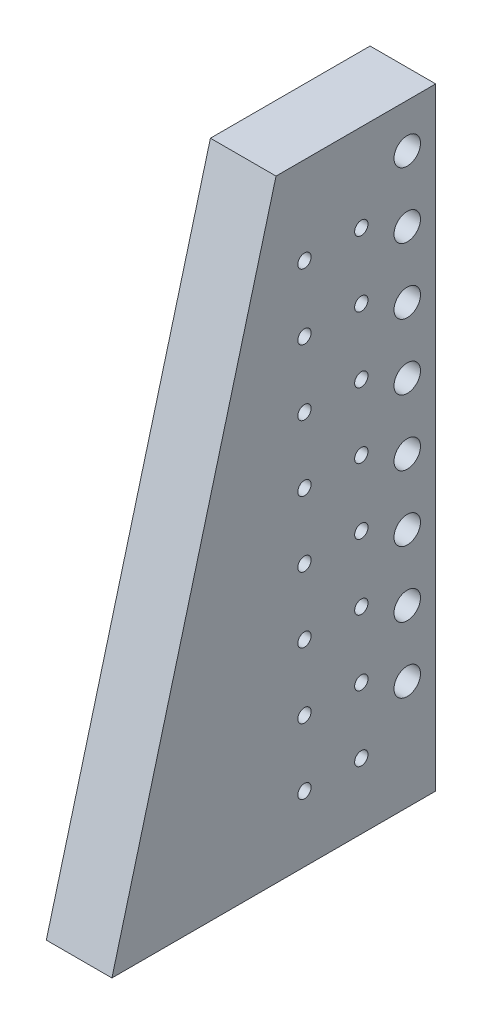
ISO-10303-21;
HEADER;
FILE_DESCRIPTION(('STEP AP214'),'2;1');
FILE_NAME('part.step','',(''),(''),'','','');
FILE_SCHEMA(('AUTOMOTIVE_DESIGN { 1 0 10303 214 1 1 1 1 }'));
ENDSEC;
DATA;
#1=APPLICATION_CONTEXT('core data for automotive mechanical design processes');
#2=APPLICATION_PROTOCOL_DEFINITION('international standard','automotive_design',2000,#1);
#3=PRODUCT_CONTEXT('',#1,'mechanical');
#4=PRODUCT('Part','Part','',(#3));
#5=PRODUCT_RELATED_PRODUCT_CATEGORY('part','',(#4));
#6=PRODUCT_DEFINITION_FORMATION('','',#4);
#7=PRODUCT_DEFINITION_CONTEXT('part definition',#1,'design');
#8=PRODUCT_DEFINITION('design','',#6,#7);
#9=PRODUCT_DEFINITION_SHAPE('','',#8);
#10=(LENGTH_UNIT() NAMED_UNIT(*) SI_UNIT(.MILLI.,.METRE.));
#11=(NAMED_UNIT(*) PLANE_ANGLE_UNIT() SI_UNIT($,.RADIAN.));
#12=(NAMED_UNIT(*) SI_UNIT($,.STERADIAN.) SOLID_ANGLE_UNIT());
#13=UNCERTAINTY_MEASURE_WITH_UNIT(LENGTH_MEASURE(1.E-05),#10,'distance_accuracy_value','');
#14=(GEOMETRIC_REPRESENTATION_CONTEXT(3) GLOBAL_UNCERTAINTY_ASSIGNED_CONTEXT((#13)) GLOBAL_UNIT_ASSIGNED_CONTEXT((#10,
#11,#12)) REPRESENTATION_CONTEXT('',''));
#15=CARTESIAN_POINT('',(0.,0.,0.));
#16=DIRECTION('',(0.,0.,1.));
#17=DIRECTION('',(1.,0.,0.));
#18=AXIS2_PLACEMENT_3D('',#15,#16,#17);
#19=CARTESIAN_POINT('',(15.,0.,0.));
#20=DIRECTION('',(-1.,0.,0.));
#21=DIRECTION('',(0.,0.,1.));
#22=AXIS2_PLACEMENT_3D('',#19,#20,#21);
#23=PLANE('',#22);
#24=DIRECTION('',(0.,1.,0.));
#25=VECTOR('',#24,1.);
#26=CARTESIAN_POINT('',(15.,-71.7948717948718,-17.9871794871795));
#27=LINE('',#26,#25);
#28=CARTESIAN_POINT('',(15.,-71.7948717948718,-17.9871794871795));
#29=VERTEX_POINT('',#28);
#30=CARTESIAN_POINT('',(15.,68.2051282051282,-17.9871794871795));
#31=VERTEX_POINT('',#30);
#32=EDGE_CURVE('E92',#29,#31,#27,.T.);
#33=ORIENTED_EDGE('',*,*,#32,.T.);
#34=DIRECTION('',(0.,0.,1.));
#35=VECTOR('',#34,1.);
#36=CARTESIAN_POINT('',(15.,68.2051282051282,18.5128205128205));
#37=LINE('',#36,#35);
#38=CARTESIAN_POINT('',(15.,68.2051282051282,18.5128205128205));
#39=VERTEX_POINT('',#38);
#40=EDGE_CURVE('E87',#31,#39,#37,.T.);
#41=ORIENTED_EDGE('',*,*,#40,.T.);
#42=DIRECTION('',(0.,-0.965925826289069,0.258819045102518));
#43=VECTOR('',#42,1.);
#44=CARTESIAN_POINT('',(15.,-71.7948717948718,56.0257074531772));
#45=LINE('',#44,#43);
#46=CARTESIAN_POINT('',(15.,-71.7948717948718,56.0257074531772));
#47=VERTEX_POINT('',#46);
#48=EDGE_CURVE('E90',#39,#47,#45,.T.);
#49=ORIENTED_EDGE('',*,*,#48,.T.);
#50=DIRECTION('',(0.,0.,-1.));
#51=VECTOR('',#50,1.);
#52=CARTESIAN_POINT('',(15.,-71.7948717948718,56.0257074531772));
#53=LINE('',#52,#51);
#54=EDGE_CURVE('E57',#47,#29,#53,.T.);
#55=ORIENTED_EDGE('',*,*,#54,.T.);
#56=EDGE_LOOP('',(#33,#41,#49,#55));
#57=FACE_BOUND('',#56,.T.);
#58=CARTESIAN_POINT('',(15.,48.205128205127,-0.987179487179588));
#59=DIRECTION('',(1.,0.,0.));
#60=DIRECTION('',(0.,0.,-1.));
#61=AXIS2_PLACEMENT_3D('',#58,#59,#60);
#62=CIRCLE('',#61,1.52500000000006);
#63=CARTESIAN_POINT('',(15.,48.205128205127,-2.51217948717965));
#64=VERTEX_POINT('',#63);
#65=EDGE_CURVE('E112',#64,#64,#62,.T.);
#66=ORIENTED_EDGE('',*,*,#65,.F.);
#67=EDGE_LOOP('',(#66));
#68=FACE_BOUND('',#67,.T.);
#69=CARTESIAN_POINT('',(15.,58.205128205127,-11.4871794871795));
#70=DIRECTION('',(1.,0.,0.));
#71=DIRECTION('',(0.,0.,-1.));
#72=AXIS2_PLACEMENT_3D('',#69,#70,#71);
#73=CIRCLE('',#72,3.02500000000035);
#74=CARTESIAN_POINT('',(15.,58.205128205127,-14.5121794871798));
#75=VERTEX_POINT('',#74);
#76=EDGE_CURVE('E134',#75,#75,#73,.T.);
#77=ORIENTED_EDGE('',*,*,#76,.F.);
#78=EDGE_LOOP('',(#77));
#79=FACE_BOUND('',#78,.T.);
#80=CARTESIAN_POINT('',(15.,43.2051282051282,-11.4871794871796));
#81=DIRECTION('',(1.,0.,0.));
#82=DIRECTION('',(0.,0.,-1.));
#83=AXIS2_PLACEMENT_3D('',#80,#81,#82);
#84=CIRCLE('',#83,3.025);
#85=CARTESIAN_POINT('',(15.,43.2051282051282,-14.5121794871796));
#86=VERTEX_POINT('',#85);
#87=EDGE_CURVE('E142',#86,#86,#84,.T.);
#88=ORIENTED_EDGE('',*,*,#87,.F.);
#89=EDGE_LOOP('',(#88));
#90=FACE_BOUND('',#89,.T.);
#91=CARTESIAN_POINT('',(15.,28.2051282051282,-11.4871794871798));
#92=DIRECTION('',(1.,0.,0.));
#93=DIRECTION('',(0.,0.,-1.));
#94=AXIS2_PLACEMENT_3D('',#91,#92,#93);
#95=CIRCLE('',#94,3.025);
#96=CARTESIAN_POINT('',(15.,28.2051282051282,-14.5121794871798));
#97=VERTEX_POINT('',#96);
#98=EDGE_CURVE('E150',#97,#97,#95,.T.);
#99=ORIENTED_EDGE('',*,*,#98,.F.);
#100=EDGE_LOOP('',(#99));
#101=FACE_BOUND('',#100,.T.);
#102=CARTESIAN_POINT('',(15.,13.2051282051282,-11.48717948718));
#103=DIRECTION('',(1.,0.,0.));
#104=DIRECTION('',(0.,0.,-1.));
#105=AXIS2_PLACEMENT_3D('',#102,#103,#104);
#106=CIRCLE('',#105,3.025);
#107=CARTESIAN_POINT('',(15.,13.2051282051282,-14.51217948718));
#108=VERTEX_POINT('',#107);
#109=EDGE_CURVE('E158',#108,#108,#106,.T.);
#110=ORIENTED_EDGE('',*,*,#109,.F.);
#111=EDGE_LOOP('',(#110));
#112=FACE_BOUND('',#111,.T.);
#113=CARTESIAN_POINT('',(15.,-1.7948717948718,-11.4871794871801));
#114=DIRECTION('',(1.,0.,0.));
#115=DIRECTION('',(0.,0.,-1.));
#116=AXIS2_PLACEMENT_3D('',#113,#114,#115);
#117=CIRCLE('',#116,3.025);
#118=CARTESIAN_POINT('',(15.,-1.7948717948718,-14.5121794871801));
#119=VERTEX_POINT('',#118);
#120=EDGE_CURVE('E166',#119,#119,#117,.T.);
#121=ORIENTED_EDGE('',*,*,#120,.F.);
#122=EDGE_LOOP('',(#121));
#123=FACE_BOUND('',#122,.T.);
#124=CARTESIAN_POINT('',(15.,-16.7948717948718,-11.4871794871803));
#125=DIRECTION('',(1.,0.,0.));
#126=DIRECTION('',(0.,0.,-1.));
#127=AXIS2_PLACEMENT_3D('',#124,#125,#126);
#128=CIRCLE('',#127,3.025);
#129=CARTESIAN_POINT('',(15.,-16.7948717948718,-14.5121794871803));
#130=VERTEX_POINT('',#129);
#131=EDGE_CURVE('E174',#130,#130,#128,.T.);
#132=ORIENTED_EDGE('',*,*,#131,.F.);
#133=EDGE_LOOP('',(#132));
#134=FACE_BOUND('',#133,.T.);
#135=CARTESIAN_POINT('',(15.,-31.7948717948718,-11.4871794871804));
#136=DIRECTION('',(1.,0.,0.));
#137=DIRECTION('',(0.,0.,-1.));
#138=AXIS2_PLACEMENT_3D('',#135,#136,#137);
#139=CIRCLE('',#138,3.025);
#140=CARTESIAN_POINT('',(15.,-31.7948717948718,-14.5121794871804));
#141=VERTEX_POINT('',#140);
#142=EDGE_CURVE('E182',#141,#141,#139,.T.);
#143=ORIENTED_EDGE('',*,*,#142,.F.);
#144=EDGE_LOOP('',(#143));
#145=FACE_BOUND('',#144,.T.);
#146=CARTESIAN_POINT('',(15.,-46.7948717948718,-11.4871794871806));
#147=DIRECTION('',(1.,0.,0.));
#148=DIRECTION('',(0.,0.,-1.));
#149=AXIS2_PLACEMENT_3D('',#146,#147,#148);
#150=CIRCLE('',#149,3.025);
#151=CARTESIAN_POINT('',(15.,-46.7948717948718,-14.5121794871806));
#152=VERTEX_POINT('',#151);
#153=EDGE_CURVE('E190',#152,#152,#150,.T.);
#154=ORIENTED_EDGE('',*,*,#153,.F.);
#155=EDGE_LOOP('',(#154));
#156=FACE_BOUND('',#155,.T.);
#157=CARTESIAN_POINT('',(15.,48.2051282051255,12.0128205128204));
#158=DIRECTION('',(1.,0.,0.));
#159=DIRECTION('',(0.,0.,-1.));
#160=AXIS2_PLACEMENT_3D('',#157,#158,#159);
#161=CIRCLE('',#160,1.52500000000014);
#162=CARTESIAN_POINT('',(15.,48.2051282051255,10.4878205128203));
#163=VERTEX_POINT('',#162);
#164=EDGE_CURVE('E198',#163,#163,#161,.T.);
#165=ORIENTED_EDGE('',*,*,#164,.F.);
#166=EDGE_LOOP('',(#165));
#167=FACE_BOUND('',#166,.T.);
#168=CARTESIAN_POINT('',(15.,33.2051282051289,-0.987179487179744));
#169=DIRECTION('',(1.,0.,0.));
#170=DIRECTION('',(0.,0.,-1.));
#171=AXIS2_PLACEMENT_3D('',#168,#169,#170);
#172=CIRCLE('',#171,1.525);
#173=CARTESIAN_POINT('',(15.,33.2051282051289,-2.51217948717974));
#174=VERTEX_POINT('',#173);
#175=EDGE_CURVE('E206',#174,#174,#172,.T.);
#176=ORIENTED_EDGE('',*,*,#175,.F.);
#177=EDGE_LOOP('',(#176));
#178=FACE_BOUND('',#177,.T.);
#179=CARTESIAN_POINT('',(15.,33.2051282051275,12.0128205128203));
#180=DIRECTION('',(1.,0.,0.));
#181=DIRECTION('',(0.,0.,-1.));
#182=AXIS2_PLACEMENT_3D('',#179,#180,#181);
#183=CIRCLE('',#182,1.525);
#184=CARTESIAN_POINT('',(15.,33.2051282051275,10.4878205128203));
#185=VERTEX_POINT('',#184);
#186=EDGE_CURVE('E214',#185,#185,#183,.T.);
#187=ORIENTED_EDGE('',*,*,#186,.F.);
#188=EDGE_LOOP('',(#187));
#189=FACE_BOUND('',#188,.T.);
#190=CARTESIAN_POINT('',(15.,18.2051282051309,-0.9871794871799));
#191=DIRECTION('',(1.,0.,0.));
#192=DIRECTION('',(0.,0.,-1.));
#193=AXIS2_PLACEMENT_3D('',#190,#191,#192);
#194=CIRCLE('',#193,1.525);
#195=CARTESIAN_POINT('',(15.,18.2051282051309,-2.5121794871799));
#196=VERTEX_POINT('',#195);
#197=EDGE_CURVE('E222',#196,#196,#194,.T.);
#198=ORIENTED_EDGE('',*,*,#197,.F.);
#199=EDGE_LOOP('',(#198));
#200=FACE_BOUND('',#199,.T.);
#201=CARTESIAN_POINT('',(15.,18.2051282051294,12.0128205128201));
#202=DIRECTION('',(1.,0.,0.));
#203=DIRECTION('',(0.,0.,-1.));
#204=AXIS2_PLACEMENT_3D('',#201,#202,#203);
#205=CIRCLE('',#204,1.525);
#206=CARTESIAN_POINT('',(15.,18.2051282051294,10.4878205128201));
#207=VERTEX_POINT('',#206);
#208=EDGE_CURVE('E230',#207,#207,#205,.T.);
#209=ORIENTED_EDGE('',*,*,#208,.F.);
#210=EDGE_LOOP('',(#209));
#211=FACE_BOUND('',#210,.T.);
#212=CARTESIAN_POINT('',(15.,3.20512820513282,-0.987179487180056));
#213=DIRECTION('',(1.,0.,0.));
#214=DIRECTION('',(0.,0.,-1.));
#215=AXIS2_PLACEMENT_3D('',#212,#213,#214);
#216=CIRCLE('',#215,1.525);
#217=CARTESIAN_POINT('',(15.,3.20512820513282,-2.51217948718006));
#218=VERTEX_POINT('',#217);
#219=EDGE_CURVE('E238',#218,#218,#216,.T.);
#220=ORIENTED_EDGE('',*,*,#219,.F.);
#221=EDGE_LOOP('',(#220));
#222=FACE_BOUND('',#221,.T.);
#223=CARTESIAN_POINT('',(15.,3.20512820513135,12.0128205128199));
#224=DIRECTION('',(1.,0.,0.));
#225=DIRECTION('',(0.,0.,-1.));
#226=AXIS2_PLACEMENT_3D('',#223,#224,#225);
#227=CIRCLE('',#226,1.525);
#228=CARTESIAN_POINT('',(15.,3.20512820513135,10.4878205128199));
#229=VERTEX_POINT('',#228);
#230=EDGE_CURVE('E246',#229,#229,#227,.T.);
#231=ORIENTED_EDGE('',*,*,#230,.F.);
#232=EDGE_LOOP('',(#231));
#233=FACE_BOUND('',#232,.T.);
#234=CARTESIAN_POINT('',(15.,-11.7948717948652,-0.987179487180213));
#235=DIRECTION('',(1.,0.,0.));
#236=DIRECTION('',(0.,0.,-1.));
#237=AXIS2_PLACEMENT_3D('',#234,#235,#236);
#238=CIRCLE('',#237,1.525);
#239=CARTESIAN_POINT('',(15.,-11.7948717948652,-2.51217948718021));
#240=VERTEX_POINT('',#239);
#241=EDGE_CURVE('E254',#240,#240,#238,.T.);
#242=ORIENTED_EDGE('',*,*,#241,.F.);
#243=EDGE_LOOP('',(#242));
#244=FACE_BOUND('',#243,.T.);
#245=CARTESIAN_POINT('',(15.,-11.7948717948667,12.0128205128198));
#246=DIRECTION('',(1.,0.,0.));
#247=DIRECTION('',(0.,0.,-1.));
#248=AXIS2_PLACEMENT_3D('',#245,#246,#247);
#249=CIRCLE('',#248,1.525);
#250=CARTESIAN_POINT('',(15.,-11.7948717948667,10.4878205128198));
#251=VERTEX_POINT('',#250);
#252=EDGE_CURVE('E262',#251,#251,#249,.T.);
#253=ORIENTED_EDGE('',*,*,#252,.F.);
#254=EDGE_LOOP('',(#253));
#255=FACE_BOUND('',#254,.T.);
#256=CARTESIAN_POINT('',(15.,-26.7948717948633,-0.987179487180369));
#257=DIRECTION('',(1.,0.,0.));
#258=DIRECTION('',(0.,0.,-1.));
#259=AXIS2_PLACEMENT_3D('',#256,#257,#258);
#260=CIRCLE('',#259,1.525);
#261=CARTESIAN_POINT('',(15.,-26.7948717948633,-2.51217948718037));
#262=VERTEX_POINT('',#261);
#263=EDGE_CURVE('E270',#262,#262,#260,.T.);
#264=ORIENTED_EDGE('',*,*,#263,.F.);
#265=EDGE_LOOP('',(#264));
#266=FACE_BOUND('',#265,.T.);
#267=CARTESIAN_POINT('',(15.,-26.7948717948648,12.0128205128196));
#268=DIRECTION('',(1.,0.,0.));
#269=DIRECTION('',(0.,0.,-1.));
#270=AXIS2_PLACEMENT_3D('',#267,#268,#269);
#271=CIRCLE('',#270,1.525);
#272=CARTESIAN_POINT('',(15.,-26.7948717948648,10.4878205128196));
#273=VERTEX_POINT('',#272);
#274=EDGE_CURVE('E278',#273,#273,#271,.T.);
#275=ORIENTED_EDGE('',*,*,#274,.F.);
#276=EDGE_LOOP('',(#275));
#277=FACE_BOUND('',#276,.T.);
#278=CARTESIAN_POINT('',(15.,-41.7948717948614,-0.987179487180525));
#279=DIRECTION('',(1.,0.,0.));
#280=DIRECTION('',(0.,0.,-1.));
#281=AXIS2_PLACEMENT_3D('',#278,#279,#280);
#282=CIRCLE('',#281,1.525);
#283=CARTESIAN_POINT('',(15.,-41.7948717948614,-2.51217948718052));
#284=VERTEX_POINT('',#283);
#285=EDGE_CURVE('E286',#284,#284,#282,.T.);
#286=ORIENTED_EDGE('',*,*,#285,.F.);
#287=EDGE_LOOP('',(#286));
#288=FACE_BOUND('',#287,.T.);
#289=CARTESIAN_POINT('',(15.,-41.7948717948628,12.0128205128195));
#290=DIRECTION('',(1.,0.,0.));
#291=DIRECTION('',(0.,0.,-1.));
#292=AXIS2_PLACEMENT_3D('',#289,#290,#291);
#293=CIRCLE('',#292,1.525);
#294=CARTESIAN_POINT('',(15.,-41.7948717948628,10.4878205128195));
#295=VERTEX_POINT('',#294);
#296=EDGE_CURVE('E294',#295,#295,#293,.T.);
#297=ORIENTED_EDGE('',*,*,#296,.F.);
#298=EDGE_LOOP('',(#297));
#299=FACE_BOUND('',#298,.T.);
#300=CARTESIAN_POINT('',(15.,-56.7948717948594,-0.987179487180681));
#301=DIRECTION('',(1.,0.,0.));
#302=DIRECTION('',(0.,0.,-1.));
#303=AXIS2_PLACEMENT_3D('',#300,#301,#302);
#304=CIRCLE('',#303,1.525);
#305=CARTESIAN_POINT('',(15.,-56.7948717948594,-2.51217948718068));
#306=VERTEX_POINT('',#305);
#307=EDGE_CURVE('E302',#306,#306,#304,.T.);
#308=ORIENTED_EDGE('',*,*,#307,.F.);
#309=EDGE_LOOP('',(#308));
#310=FACE_BOUND('',#309,.T.);
#311=CARTESIAN_POINT('',(15.,-56.7948717948609,12.0128205128193));
#312=DIRECTION('',(1.,0.,0.));
#313=DIRECTION('',(0.,0.,-1.));
#314=AXIS2_PLACEMENT_3D('',#311,#312,#313);
#315=CIRCLE('',#314,1.525);
#316=CARTESIAN_POINT('',(15.,-56.7948717948609,10.4878205128193));
#317=VERTEX_POINT('',#316);
#318=EDGE_CURVE('E310',#317,#317,#315,.T.);
#319=ORIENTED_EDGE('',*,*,#318,.F.);
#320=EDGE_LOOP('',(#319));
#321=FACE_BOUND('',#320,.T.);
#322=ADVANCED_FACE('F39',(#57,#68,#79,#90,#101,#112,#123,#134,#145,#156,#167,#178,#189,#200,
#211,#222,#233,#244,#255,#266,#277,#288,#299,#310,#321),#23,.F.);
#323=CARTESIAN_POINT('',(0.,0.,0.));
#324=DIRECTION('',(-1.,0.,0.));
#325=DIRECTION('',(0.,0.,1.));
#326=AXIS2_PLACEMENT_3D('',#323,#324,#325);
#327=PLANE('',#326);
#328=CARTESIAN_POINT('',(0.,-56.7948717948594,-0.987179487180681));
#329=DIRECTION('',(1.,0.,0.));
#330=DIRECTION('',(0.,0.,-1.));
#331=AXIS2_PLACEMENT_3D('',#328,#329,#330);
#332=CIRCLE('',#331,1.525);
#333=CARTESIAN_POINT('',(0.,-56.7948717948594,-2.51217948718068));
#334=VERTEX_POINT('',#333);
#335=EDGE_CURVE('E306',#334,#334,#332,.T.);
#336=ORIENTED_EDGE('',*,*,#335,.T.);
#337=EDGE_LOOP('',(#336));
#338=FACE_BOUND('',#337,.T.);
#339=CARTESIAN_POINT('',(0.,-41.7948717948614,-0.987179487180525));
#340=DIRECTION('',(1.,0.,0.));
#341=DIRECTION('',(0.,0.,-1.));
#342=AXIS2_PLACEMENT_3D('',#339,#340,#341);
#343=CIRCLE('',#342,1.525);
#344=CARTESIAN_POINT('',(0.,-41.7948717948614,-2.51217948718052));
#345=VERTEX_POINT('',#344);
#346=EDGE_CURVE('E290',#345,#345,#343,.T.);
#347=ORIENTED_EDGE('',*,*,#346,.T.);
#348=EDGE_LOOP('',(#347));
#349=FACE_BOUND('',#348,.T.);
#350=CARTESIAN_POINT('',(0.,-26.7948717948633,-0.987179487180369));
#351=DIRECTION('',(1.,0.,0.));
#352=DIRECTION('',(0.,0.,-1.));
#353=AXIS2_PLACEMENT_3D('',#350,#351,#352);
#354=CIRCLE('',#353,1.525);
#355=CARTESIAN_POINT('',(0.,-26.7948717948633,-2.51217948718037));
#356=VERTEX_POINT('',#355);
#357=EDGE_CURVE('E274',#356,#356,#354,.T.);
#358=ORIENTED_EDGE('',*,*,#357,.T.);
#359=EDGE_LOOP('',(#358));
#360=FACE_BOUND('',#359,.T.);
#361=CARTESIAN_POINT('',(0.,-11.7948717948652,-0.987179487180213));
#362=DIRECTION('',(1.,0.,0.));
#363=DIRECTION('',(0.,0.,-1.));
#364=AXIS2_PLACEMENT_3D('',#361,#362,#363);
#365=CIRCLE('',#364,1.525);
#366=CARTESIAN_POINT('',(0.,-11.7948717948652,-2.51217948718021));
#367=VERTEX_POINT('',#366);
#368=EDGE_CURVE('E258',#367,#367,#365,.T.);
#369=ORIENTED_EDGE('',*,*,#368,.T.);
#370=EDGE_LOOP('',(#369));
#371=FACE_BOUND('',#370,.T.);
#372=CARTESIAN_POINT('',(0.,3.20512820513282,-0.987179487180056));
#373=DIRECTION('',(1.,0.,0.));
#374=DIRECTION('',(0.,0.,-1.));
#375=AXIS2_PLACEMENT_3D('',#372,#373,#374);
#376=CIRCLE('',#375,1.525);
#377=CARTESIAN_POINT('',(0.,3.20512820513282,-2.51217948718006));
#378=VERTEX_POINT('',#377);
#379=EDGE_CURVE('E242',#378,#378,#376,.T.);
#380=ORIENTED_EDGE('',*,*,#379,.T.);
#381=EDGE_LOOP('',(#380));
#382=FACE_BOUND('',#381,.T.);
#383=CARTESIAN_POINT('',(0.,18.2051282051309,-0.9871794871799));
#384=DIRECTION('',(1.,0.,0.));
#385=DIRECTION('',(0.,0.,-1.));
#386=AXIS2_PLACEMENT_3D('',#383,#384,#385);
#387=CIRCLE('',#386,1.525);
#388=CARTESIAN_POINT('',(0.,18.2051282051309,-2.5121794871799));
#389=VERTEX_POINT('',#388);
#390=EDGE_CURVE('E226',#389,#389,#387,.T.);
#391=ORIENTED_EDGE('',*,*,#390,.T.);
#392=EDGE_LOOP('',(#391));
#393=FACE_BOUND('',#392,.T.);
#394=CARTESIAN_POINT('',(0.,33.2051282051289,-0.987179487179744));
#395=DIRECTION('',(1.,0.,0.));
#396=DIRECTION('',(0.,0.,-1.));
#397=AXIS2_PLACEMENT_3D('',#394,#395,#396);
#398=CIRCLE('',#397,1.525);
#399=CARTESIAN_POINT('',(0.,33.2051282051289,-2.51217948717974));
#400=VERTEX_POINT('',#399);
#401=EDGE_CURVE('E210',#400,#400,#398,.T.);
#402=ORIENTED_EDGE('',*,*,#401,.T.);
#403=EDGE_LOOP('',(#402));
#404=FACE_BOUND('',#403,.T.);
#405=CARTESIAN_POINT('',(0.,-46.7948717948718,-11.4871794871806));
#406=DIRECTION('',(1.,0.,0.));
#407=DIRECTION('',(0.,0.,-1.));
#408=AXIS2_PLACEMENT_3D('',#405,#406,#407);
#409=CIRCLE('',#408,3.025);
#410=CARTESIAN_POINT('',(0.,-46.7948717948718,-14.5121794871806));
#411=VERTEX_POINT('',#410);
#412=EDGE_CURVE('E194',#411,#411,#409,.T.);
#413=ORIENTED_EDGE('',*,*,#412,.T.);
#414=EDGE_LOOP('',(#413));
#415=FACE_BOUND('',#414,.T.);
#416=CARTESIAN_POINT('',(0.,-16.7948717948718,-11.4871794871803));
#417=DIRECTION('',(1.,0.,0.));
#418=DIRECTION('',(0.,0.,-1.));
#419=AXIS2_PLACEMENT_3D('',#416,#417,#418);
#420=CIRCLE('',#419,3.025);
#421=CARTESIAN_POINT('',(0.,-16.7948717948718,-14.5121794871803));
#422=VERTEX_POINT('',#421);
#423=EDGE_CURVE('E178',#422,#422,#420,.T.);
#424=ORIENTED_EDGE('',*,*,#423,.T.);
#425=EDGE_LOOP('',(#424));
#426=FACE_BOUND('',#425,.T.);
#427=CARTESIAN_POINT('',(0.,13.2051282051282,-11.48717948718));
#428=DIRECTION('',(1.,0.,0.));
#429=DIRECTION('',(0.,0.,-1.));
#430=AXIS2_PLACEMENT_3D('',#427,#428,#429);
#431=CIRCLE('',#430,3.025);
#432=CARTESIAN_POINT('',(0.,13.2051282051282,-14.51217948718));
#433=VERTEX_POINT('',#432);
#434=EDGE_CURVE('E162',#433,#433,#431,.T.);
#435=ORIENTED_EDGE('',*,*,#434,.T.);
#436=EDGE_LOOP('',(#435));
#437=FACE_BOUND('',#436,.T.);
#438=CARTESIAN_POINT('',(0.,43.2051282051282,-11.4871794871796));
#439=DIRECTION('',(1.,0.,0.));
#440=DIRECTION('',(0.,0.,-1.));
#441=AXIS2_PLACEMENT_3D('',#438,#439,#440);
#442=CIRCLE('',#441,3.025);
#443=CARTESIAN_POINT('',(0.,43.2051282051282,-14.5121794871796));
#444=VERTEX_POINT('',#443);
#445=EDGE_CURVE('E146',#444,#444,#442,.T.);
#446=ORIENTED_EDGE('',*,*,#445,.T.);
#447=EDGE_LOOP('',(#446));
#448=FACE_BOUND('',#447,.T.);
#449=CARTESIAN_POINT('',(0.,48.205128205127,-0.987179487179588));
#450=DIRECTION('',(1.,0.,0.));
#451=DIRECTION('',(0.,0.,-1.));
#452=AXIS2_PLACEMENT_3D('',#449,#450,#451);
#453=CIRCLE('',#452,1.52500000000006);
#454=CARTESIAN_POINT('',(0.,48.205128205127,-2.51217948717965));
#455=VERTEX_POINT('',#454);
#456=EDGE_CURVE('E130',#455,#455,#453,.T.);
#457=ORIENTED_EDGE('',*,*,#456,.T.);
#458=EDGE_LOOP('',(#457));
#459=FACE_BOUND('',#458,.T.);
#460=DIRECTION('',(0.,1.,0.));
#461=VECTOR('',#460,1.);
#462=CARTESIAN_POINT('',(0.,-71.7948717948718,-17.9871794871795));
#463=LINE('',#462,#461);
#464=CARTESIAN_POINT('',(0.,-71.7948717948718,-17.9871794871795));
#465=VERTEX_POINT('',#464);
#466=CARTESIAN_POINT('',(0.,68.2051282051282,-17.9871794871795));
#467=VERTEX_POINT('',#466);
#468=EDGE_CURVE('E108',#465,#467,#463,.T.);
#469=ORIENTED_EDGE('',*,*,#468,.F.);
#470=DIRECTION('',(0.,0.,-1.));
#471=VECTOR('',#470,1.);
#472=CARTESIAN_POINT('',(0.,-71.7948717948718,56.0257074531772));
#473=LINE('',#472,#471);
#474=CARTESIAN_POINT('',(0.,-71.7948717948718,56.0257074531772));
#475=VERTEX_POINT('',#474);
#476=EDGE_CURVE('E80',#475,#465,#473,.T.);
#477=ORIENTED_EDGE('',*,*,#476,.F.);
#478=DIRECTION('',(0.,-0.965925826289069,0.258819045102518));
#479=VECTOR('',#478,1.);
#480=CARTESIAN_POINT('',(0.,-71.7948717948718,56.0257074531772));
#481=LINE('',#480,#479);
#482=CARTESIAN_POINT('',(0.,68.2051282051282,18.5128205128205));
#483=VERTEX_POINT('',#482);
#484=EDGE_CURVE('E74',#483,#475,#481,.T.);
#485=ORIENTED_EDGE('',*,*,#484,.F.);
#486=DIRECTION('',(0.,0.,1.));
#487=VECTOR('',#486,1.);
#488=CARTESIAN_POINT('',(0.,68.2051282051282,18.5128205128205));
#489=LINE('',#488,#487);
#490=EDGE_CURVE('E97',#467,#483,#489,.T.);
#491=ORIENTED_EDGE('',*,*,#490,.F.);
#492=EDGE_LOOP('',(#469,#477,#485,#491));
#493=FACE_BOUND('',#492,.T.);
#494=CARTESIAN_POINT('',(0.,58.205128205127,-11.4871794871795));
#495=DIRECTION('',(1.,0.,0.));
#496=DIRECTION('',(0.,0.,-1.));
#497=AXIS2_PLACEMENT_3D('',#494,#495,#496);
#498=CIRCLE('',#497,3.02500000000035);
#499=CARTESIAN_POINT('',(0.,58.205128205127,-14.5121794871798));
#500=VERTEX_POINT('',#499);
#501=EDGE_CURVE('E138',#500,#500,#498,.T.);
#502=ORIENTED_EDGE('',*,*,#501,.T.);
#503=EDGE_LOOP('',(#502));
#504=FACE_BOUND('',#503,.T.);
#505=CARTESIAN_POINT('',(0.,28.2051282051282,-11.4871794871798));
#506=DIRECTION('',(1.,0.,0.));
#507=DIRECTION('',(0.,0.,-1.));
#508=AXIS2_PLACEMENT_3D('',#505,#506,#507);
#509=CIRCLE('',#508,3.025);
#510=CARTESIAN_POINT('',(0.,28.2051282051282,-14.5121794871798));
#511=VERTEX_POINT('',#510);
#512=EDGE_CURVE('E154',#511,#511,#509,.T.);
#513=ORIENTED_EDGE('',*,*,#512,.T.);
#514=EDGE_LOOP('',(#513));
#515=FACE_BOUND('',#514,.T.);
#516=CARTESIAN_POINT('',(0.,-1.7948717948718,-11.4871794871801));
#517=DIRECTION('',(1.,0.,0.));
#518=DIRECTION('',(0.,0.,-1.));
#519=AXIS2_PLACEMENT_3D('',#516,#517,#518);
#520=CIRCLE('',#519,3.025);
#521=CARTESIAN_POINT('',(0.,-1.7948717948718,-14.5121794871801));
#522=VERTEX_POINT('',#521);
#523=EDGE_CURVE('E170',#522,#522,#520,.T.);
#524=ORIENTED_EDGE('',*,*,#523,.T.);
#525=EDGE_LOOP('',(#524));
#526=FACE_BOUND('',#525,.T.);
#527=CARTESIAN_POINT('',(0.,-31.7948717948718,-11.4871794871804));
#528=DIRECTION('',(1.,0.,0.));
#529=DIRECTION('',(0.,0.,-1.));
#530=AXIS2_PLACEMENT_3D('',#527,#528,#529);
#531=CIRCLE('',#530,3.025);
#532=CARTESIAN_POINT('',(0.,-31.7948717948718,-14.5121794871804));
#533=VERTEX_POINT('',#532);
#534=EDGE_CURVE('E186',#533,#533,#531,.T.);
#535=ORIENTED_EDGE('',*,*,#534,.T.);
#536=EDGE_LOOP('',(#535));
#537=FACE_BOUND('',#536,.T.);
#538=CARTESIAN_POINT('',(0.,48.2051282051255,12.0128205128204));
#539=DIRECTION('',(1.,0.,0.));
#540=DIRECTION('',(0.,0.,-1.));
#541=AXIS2_PLACEMENT_3D('',#538,#539,#540);
#542=CIRCLE('',#541,1.52500000000014);
#543=CARTESIAN_POINT('',(0.,48.2051282051255,10.4878205128203));
#544=VERTEX_POINT('',#543);
#545=EDGE_CURVE('E202',#544,#544,#542,.T.);
#546=ORIENTED_EDGE('',*,*,#545,.T.);
#547=EDGE_LOOP('',(#546));
#548=FACE_BOUND('',#547,.T.);
#549=CARTESIAN_POINT('',(0.,33.2051282051275,12.0128205128203));
#550=DIRECTION('',(1.,0.,0.));
#551=DIRECTION('',(0.,0.,-1.));
#552=AXIS2_PLACEMENT_3D('',#549,#550,#551);
#553=CIRCLE('',#552,1.525);
#554=CARTESIAN_POINT('',(0.,33.2051282051275,10.4878205128203));
#555=VERTEX_POINT('',#554);
#556=EDGE_CURVE('E218',#555,#555,#553,.T.);
#557=ORIENTED_EDGE('',*,*,#556,.T.);
#558=EDGE_LOOP('',(#557));
#559=FACE_BOUND('',#558,.T.);
#560=CARTESIAN_POINT('',(0.,18.2051282051294,12.0128205128201));
#561=DIRECTION('',(1.,0.,0.));
#562=DIRECTION('',(0.,0.,-1.));
#563=AXIS2_PLACEMENT_3D('',#560,#561,#562);
#564=CIRCLE('',#563,1.525);
#565=CARTESIAN_POINT('',(0.,18.2051282051294,10.4878205128201));
#566=VERTEX_POINT('',#565);
#567=EDGE_CURVE('E234',#566,#566,#564,.T.);
#568=ORIENTED_EDGE('',*,*,#567,.T.);
#569=EDGE_LOOP('',(#568));
#570=FACE_BOUND('',#569,.T.);
#571=CARTESIAN_POINT('',(0.,3.20512820513135,12.0128205128199));
#572=DIRECTION('',(1.,0.,0.));
#573=DIRECTION('',(0.,0.,-1.));
#574=AXIS2_PLACEMENT_3D('',#571,#572,#573);
#575=CIRCLE('',#574,1.525);
#576=CARTESIAN_POINT('',(0.,3.20512820513135,10.4878205128199));
#577=VERTEX_POINT('',#576);
#578=EDGE_CURVE('E250',#577,#577,#575,.T.);
#579=ORIENTED_EDGE('',*,*,#578,.T.);
#580=EDGE_LOOP('',(#579));
#581=FACE_BOUND('',#580,.T.);
#582=CARTESIAN_POINT('',(0.,-11.7948717948667,12.0128205128198));
#583=DIRECTION('',(1.,0.,0.));
#584=DIRECTION('',(0.,0.,-1.));
#585=AXIS2_PLACEMENT_3D('',#582,#583,#584);
#586=CIRCLE('',#585,1.525);
#587=CARTESIAN_POINT('',(0.,-11.7948717948667,10.4878205128198));
#588=VERTEX_POINT('',#587);
#589=EDGE_CURVE('E266',#588,#588,#586,.T.);
#590=ORIENTED_EDGE('',*,*,#589,.T.);
#591=EDGE_LOOP('',(#590));
#592=FACE_BOUND('',#591,.T.);
#593=CARTESIAN_POINT('',(0.,-26.7948717948648,12.0128205128196));
#594=DIRECTION('',(1.,0.,0.));
#595=DIRECTION('',(0.,0.,-1.));
#596=AXIS2_PLACEMENT_3D('',#593,#594,#595);
#597=CIRCLE('',#596,1.525);
#598=CARTESIAN_POINT('',(0.,-26.7948717948648,10.4878205128196));
#599=VERTEX_POINT('',#598);
#600=EDGE_CURVE('E282',#599,#599,#597,.T.);
#601=ORIENTED_EDGE('',*,*,#600,.T.);
#602=EDGE_LOOP('',(#601));
#603=FACE_BOUND('',#602,.T.);
#604=CARTESIAN_POINT('',(0.,-41.7948717948628,12.0128205128195));
#605=DIRECTION('',(1.,0.,0.));
#606=DIRECTION('',(0.,0.,-1.));
#607=AXIS2_PLACEMENT_3D('',#604,#605,#606);
#608=CIRCLE('',#607,1.525);
#609=CARTESIAN_POINT('',(0.,-41.7948717948628,10.4878205128195));
#610=VERTEX_POINT('',#609);
#611=EDGE_CURVE('E298',#610,#610,#608,.T.);
#612=ORIENTED_EDGE('',*,*,#611,.T.);
#613=EDGE_LOOP('',(#612));
#614=FACE_BOUND('',#613,.T.);
#615=CARTESIAN_POINT('',(0.,-56.7948717948609,12.0128205128193));
#616=DIRECTION('',(1.,0.,0.));
#617=DIRECTION('',(0.,0.,-1.));
#618=AXIS2_PLACEMENT_3D('',#615,#616,#617);
#619=CIRCLE('',#618,1.525);
#620=CARTESIAN_POINT('',(0.,-56.7948717948609,10.4878205128193));
#621=VERTEX_POINT('',#620);
#622=EDGE_CURVE('E314',#621,#621,#619,.T.);
#623=ORIENTED_EDGE('',*,*,#622,.T.);
#624=EDGE_LOOP('',(#623));
#625=FACE_BOUND('',#624,.T.);
#626=ADVANCED_FACE('F125',(#338,#349,#360,#371,#382,#393,#404,#415,#426,#437,#448,#459,#493,
#504,#515,#526,#537,#548,#559,#570,#581,#592,#603,#614,#625),#327,.T.);
#627=CARTESIAN_POINT('',(15.,-71.7948717948718,-17.9871794871795));
#628=DIRECTION('',(0.,0.,1.));
#629=DIRECTION('',(0.,-1.,0.));
#630=AXIS2_PLACEMENT_3D('',#627,#628,#629);
#631=PLANE('',#630);
#632=ORIENTED_EDGE('',*,*,#468,.T.);
#633=DIRECTION('',(-1.,0.,0.));
#634=VECTOR('',#633,1.);
#635=CARTESIAN_POINT('',(15.,68.2051282051282,-17.9871794871795));
#636=LINE('',#635,#634);
#637=EDGE_CURVE('E11',#31,#467,#636,.T.);
#638=ORIENTED_EDGE('',*,*,#637,.F.);
#639=ORIENTED_EDGE('',*,*,#32,.F.);
#640=DIRECTION('',(-1.,0.,0.));
#641=VECTOR('',#640,1.);
#642=CARTESIAN_POINT('',(15.,-71.7948717948718,-17.9871794871795));
#643=LINE('',#642,#641);
#644=EDGE_CURVE('E104',#29,#465,#643,.T.);
#645=ORIENTED_EDGE('',*,*,#644,.T.);
#646=EDGE_LOOP('',(#632,#638,#639,#645));
#647=FACE_BOUND('',#646,.T.);
#648=ADVANCED_FACE('F41',(#647),#631,.F.);
#649=CARTESIAN_POINT('',(15.,68.2051282051282,18.5128205128205));
#650=DIRECTION('',(0.,-1.,0.));
#651=DIRECTION('',(0.,0.,-1.));
#652=AXIS2_PLACEMENT_3D('',#649,#650,#651);
#653=PLANE('',#652);
#654=ORIENTED_EDGE('',*,*,#490,.T.);
#655=DIRECTION('',(-1.,0.,0.));
#656=VECTOR('',#655,1.);
#657=CARTESIAN_POINT('',(15.,68.2051282051282,18.5128205128205));
#658=LINE('',#657,#656);
#659=EDGE_CURVE('E49',#39,#483,#658,.T.);
#660=ORIENTED_EDGE('',*,*,#659,.F.);
#661=ORIENTED_EDGE('',*,*,#40,.F.);
#662=ORIENTED_EDGE('',*,*,#637,.T.);
#663=EDGE_LOOP('',(#654,#660,#661,#662));
#664=FACE_BOUND('',#663,.T.);
#665=ADVANCED_FACE('F96',(#664),#653,.F.);
#666=CARTESIAN_POINT('',(15.,-71.7948717948718,56.0257074531772));
#667=DIRECTION('',(0.,-0.258819045102518,-0.965925826289069));
#668=DIRECTION('',(0.,0.965925826289069,-0.258819045102518));
#669=AXIS2_PLACEMENT_3D('',#666,#667,#668);
#670=PLANE('',#669);
#671=ORIENTED_EDGE('',*,*,#484,.T.);
#672=DIRECTION('',(-1.,0.,0.));
#673=VECTOR('',#672,1.);
#674=CARTESIAN_POINT('',(15.,-71.7948717948718,56.0257074531772));
#675=LINE('',#674,#673);
#676=EDGE_CURVE('E99',#47,#475,#675,.T.);
#677=ORIENTED_EDGE('',*,*,#676,.F.);
#678=ORIENTED_EDGE('',*,*,#48,.F.);
#679=ORIENTED_EDGE('',*,*,#659,.T.);
#680=EDGE_LOOP('',(#671,#677,#678,#679));
#681=FACE_BOUND('',#680,.T.);
#682=ADVANCED_FACE('F100',(#681),#670,.F.);
#683=CARTESIAN_POINT('',(15.,-71.7948717948718,56.0257074531772));
#684=DIRECTION('',(0.,1.,0.));
#685=DIRECTION('',(0.,0.,1.));
#686=AXIS2_PLACEMENT_3D('',#683,#684,#685);
#687=PLANE('',#686);
#688=ORIENTED_EDGE('',*,*,#476,.T.);
#689=ORIENTED_EDGE('',*,*,#644,.F.);
#690=ORIENTED_EDGE('',*,*,#54,.F.);
#691=ORIENTED_EDGE('',*,*,#676,.T.);
#692=EDGE_LOOP('',(#688,#689,#690,#691));
#693=FACE_BOUND('',#692,.T.);
#694=ADVANCED_FACE('F122',(#693),#687,.F.);
#695=CARTESIAN_POINT('',(15.,48.205128205127,-0.987179487179588));
#696=DIRECTION('',(-1.,0.,0.));
#697=DIRECTION('',(0.,0.,1.));
#698=AXIS2_PLACEMENT_3D('',#695,#696,#697);
#699=CYLINDRICAL_SURFACE('',#698,1.52500000000006);
#700=ORIENTED_EDGE('',*,*,#65,.T.);
#701=EDGE_LOOP('',(#700));
#702=FACE_BOUND('',#701,.T.);
#703=ORIENTED_EDGE('',*,*,#456,.F.);
#704=EDGE_LOOP('',(#703));
#705=FACE_BOUND('',#704,.T.);
#706=ADVANCED_FACE('F333',(#702,#705),#699,.F.);
#707=CARTESIAN_POINT('',(15.,58.205128205127,-11.4871794871795));
#708=DIRECTION('',(-1.,0.,0.));
#709=DIRECTION('',(0.,0.,1.));
#710=AXIS2_PLACEMENT_3D('',#707,#708,#709);
#711=CYLINDRICAL_SURFACE('',#710,3.02500000000035);
#712=ORIENTED_EDGE('',*,*,#76,.T.);
#713=EDGE_LOOP('',(#712));
#714=FACE_BOUND('',#713,.T.);
#715=ORIENTED_EDGE('',*,*,#501,.F.);
#716=EDGE_LOOP('',(#715));
#717=FACE_BOUND('',#716,.T.);
#718=ADVANCED_FACE('F379',(#714,#717),#711,.F.);
#719=CARTESIAN_POINT('',(15.,43.2051282051282,-11.4871794871796));
#720=DIRECTION('',(-1.,0.,0.));
#721=DIRECTION('',(0.,0.,1.));
#722=AXIS2_PLACEMENT_3D('',#719,#720,#721);
#723=CYLINDRICAL_SURFACE('',#722,3.025);
#724=ORIENTED_EDGE('',*,*,#87,.T.);
#725=EDGE_LOOP('',(#724));
#726=FACE_BOUND('',#725,.T.);
#727=ORIENTED_EDGE('',*,*,#445,.F.);
#728=EDGE_LOOP('',(#727));
#729=FACE_BOUND('',#728,.T.);
#730=ADVANCED_FACE('F387',(#726,#729),#723,.F.);
#731=CARTESIAN_POINT('',(15.,28.2051282051282,-11.4871794871798));
#732=DIRECTION('',(-1.,0.,0.));
#733=DIRECTION('',(0.,0.,1.));
#734=AXIS2_PLACEMENT_3D('',#731,#732,#733);
#735=CYLINDRICAL_SURFACE('',#734,3.025);
#736=ORIENTED_EDGE('',*,*,#98,.T.);
#737=EDGE_LOOP('',(#736));
#738=FACE_BOUND('',#737,.T.);
#739=ORIENTED_EDGE('',*,*,#512,.F.);
#740=EDGE_LOOP('',(#739));
#741=FACE_BOUND('',#740,.T.);
#742=ADVANCED_FACE('F395',(#738,#741),#735,.F.);
#743=CARTESIAN_POINT('',(15.,13.2051282051282,-11.48717948718));
#744=DIRECTION('',(-1.,0.,0.));
#745=DIRECTION('',(0.,0.,1.));
#746=AXIS2_PLACEMENT_3D('',#743,#744,#745);
#747=CYLINDRICAL_SURFACE('',#746,3.025);
#748=ORIENTED_EDGE('',*,*,#109,.T.);
#749=EDGE_LOOP('',(#748));
#750=FACE_BOUND('',#749,.T.);
#751=ORIENTED_EDGE('',*,*,#434,.F.);
#752=EDGE_LOOP('',(#751));
#753=FACE_BOUND('',#752,.T.);
#754=ADVANCED_FACE('F404',(#750,#753),#747,.F.);
#755=CARTESIAN_POINT('',(15.,-1.7948717948718,-11.4871794871801));
#756=DIRECTION('',(-1.,0.,0.));
#757=DIRECTION('',(0.,0.,1.));
#758=AXIS2_PLACEMENT_3D('',#755,#756,#757);
#759=CYLINDRICAL_SURFACE('',#758,3.025);
#760=ORIENTED_EDGE('',*,*,#120,.T.);
#761=EDGE_LOOP('',(#760));
#762=FACE_BOUND('',#761,.T.);
#763=ORIENTED_EDGE('',*,*,#523,.F.);
#764=EDGE_LOOP('',(#763));
#765=FACE_BOUND('',#764,.T.);
#766=ADVANCED_FACE('F413',(#762,#765),#759,.F.);
#767=CARTESIAN_POINT('',(15.,-16.7948717948718,-11.4871794871803));
#768=DIRECTION('',(-1.,0.,0.));
#769=DIRECTION('',(0.,0.,1.));
#770=AXIS2_PLACEMENT_3D('',#767,#768,#769);
#771=CYLINDRICAL_SURFACE('',#770,3.025);
#772=ORIENTED_EDGE('',*,*,#131,.T.);
#773=EDGE_LOOP('',(#772));
#774=FACE_BOUND('',#773,.T.);
#775=ORIENTED_EDGE('',*,*,#423,.F.);
#776=EDGE_LOOP('',(#775));
#777=FACE_BOUND('',#776,.T.);
#778=ADVANCED_FACE('F422',(#774,#777),#771,.F.);
#779=CARTESIAN_POINT('',(15.,-31.7948717948718,-11.4871794871804));
#780=DIRECTION('',(-1.,0.,0.));
#781=DIRECTION('',(0.,0.,1.));
#782=AXIS2_PLACEMENT_3D('',#779,#780,#781);
#783=CYLINDRICAL_SURFACE('',#782,3.025);
#784=ORIENTED_EDGE('',*,*,#142,.T.);
#785=EDGE_LOOP('',(#784));
#786=FACE_BOUND('',#785,.T.);
#787=ORIENTED_EDGE('',*,*,#534,.F.);
#788=EDGE_LOOP('',(#787));
#789=FACE_BOUND('',#788,.T.);
#790=ADVANCED_FACE('F431',(#786,#789),#783,.F.);
#791=CARTESIAN_POINT('',(15.,-46.7948717948718,-11.4871794871806));
#792=DIRECTION('',(-1.,0.,0.));
#793=DIRECTION('',(0.,0.,1.));
#794=AXIS2_PLACEMENT_3D('',#791,#792,#793);
#795=CYLINDRICAL_SURFACE('',#794,3.025);
#796=ORIENTED_EDGE('',*,*,#153,.T.);
#797=EDGE_LOOP('',(#796));
#798=FACE_BOUND('',#797,.T.);
#799=ORIENTED_EDGE('',*,*,#412,.F.);
#800=EDGE_LOOP('',(#799));
#801=FACE_BOUND('',#800,.T.);
#802=ADVANCED_FACE('F440',(#798,#801),#795,.F.);
#803=CARTESIAN_POINT('',(15.,48.2051282051255,12.0128205128204));
#804=DIRECTION('',(-1.,0.,0.));
#805=DIRECTION('',(0.,0.,1.));
#806=AXIS2_PLACEMENT_3D('',#803,#804,#805);
#807=CYLINDRICAL_SURFACE('',#806,1.52500000000014);
#808=ORIENTED_EDGE('',*,*,#164,.T.);
#809=EDGE_LOOP('',(#808));
#810=FACE_BOUND('',#809,.T.);
#811=ORIENTED_EDGE('',*,*,#545,.F.);
#812=EDGE_LOOP('',(#811));
#813=FACE_BOUND('',#812,.T.);
#814=ADVANCED_FACE('F449',(#810,#813),#807,.F.);
#815=CARTESIAN_POINT('',(15.,33.2051282051289,-0.987179487179744));
#816=DIRECTION('',(-1.,0.,0.));
#817=DIRECTION('',(0.,0.,1.));
#818=AXIS2_PLACEMENT_3D('',#815,#816,#817);
#819=CYLINDRICAL_SURFACE('',#818,1.525);
#820=ORIENTED_EDGE('',*,*,#175,.T.);
#821=EDGE_LOOP('',(#820));
#822=FACE_BOUND('',#821,.T.);
#823=ORIENTED_EDGE('',*,*,#401,.F.);
#824=EDGE_LOOP('',(#823));
#825=FACE_BOUND('',#824,.T.);
#826=ADVANCED_FACE('F458',(#822,#825),#819,.F.);
#827=CARTESIAN_POINT('',(15.,33.2051282051275,12.0128205128203));
#828=DIRECTION('',(-1.,0.,0.));
#829=DIRECTION('',(0.,0.,1.));
#830=AXIS2_PLACEMENT_3D('',#827,#828,#829);
#831=CYLINDRICAL_SURFACE('',#830,1.525);
#832=ORIENTED_EDGE('',*,*,#186,.T.);
#833=EDGE_LOOP('',(#832));
#834=FACE_BOUND('',#833,.T.);
#835=ORIENTED_EDGE('',*,*,#556,.F.);
#836=EDGE_LOOP('',(#835));
#837=FACE_BOUND('',#836,.T.);
#838=ADVANCED_FACE('F467',(#834,#837),#831,.F.);
#839=CARTESIAN_POINT('',(15.,18.2051282051309,-0.9871794871799));
#840=DIRECTION('',(-1.,0.,0.));
#841=DIRECTION('',(0.,0.,1.));
#842=AXIS2_PLACEMENT_3D('',#839,#840,#841);
#843=CYLINDRICAL_SURFACE('',#842,1.525);
#844=ORIENTED_EDGE('',*,*,#197,.T.);
#845=EDGE_LOOP('',(#844));
#846=FACE_BOUND('',#845,.T.);
#847=ORIENTED_EDGE('',*,*,#390,.F.);
#848=EDGE_LOOP('',(#847));
#849=FACE_BOUND('',#848,.T.);
#850=ADVANCED_FACE('F476',(#846,#849),#843,.F.);
#851=CARTESIAN_POINT('',(15.,18.2051282051294,12.0128205128201));
#852=DIRECTION('',(-1.,0.,0.));
#853=DIRECTION('',(0.,0.,1.));
#854=AXIS2_PLACEMENT_3D('',#851,#852,#853);
#855=CYLINDRICAL_SURFACE('',#854,1.525);
#856=ORIENTED_EDGE('',*,*,#208,.T.);
#857=EDGE_LOOP('',(#856));
#858=FACE_BOUND('',#857,.T.);
#859=ORIENTED_EDGE('',*,*,#567,.F.);
#860=EDGE_LOOP('',(#859));
#861=FACE_BOUND('',#860,.T.);
#862=ADVANCED_FACE('F485',(#858,#861),#855,.F.);
#863=CARTESIAN_POINT('',(15.,3.20512820513282,-0.987179487180056));
#864=DIRECTION('',(-1.,0.,0.));
#865=DIRECTION('',(0.,0.,1.));
#866=AXIS2_PLACEMENT_3D('',#863,#864,#865);
#867=CYLINDRICAL_SURFACE('',#866,1.525);
#868=ORIENTED_EDGE('',*,*,#219,.T.);
#869=EDGE_LOOP('',(#868));
#870=FACE_BOUND('',#869,.T.);
#871=ORIENTED_EDGE('',*,*,#379,.F.);
#872=EDGE_LOOP('',(#871));
#873=FACE_BOUND('',#872,.T.);
#874=ADVANCED_FACE('F494',(#870,#873),#867,.F.);
#875=CARTESIAN_POINT('',(15.,3.20512820513135,12.0128205128199));
#876=DIRECTION('',(-1.,0.,0.));
#877=DIRECTION('',(0.,0.,1.));
#878=AXIS2_PLACEMENT_3D('',#875,#876,#877);
#879=CYLINDRICAL_SURFACE('',#878,1.525);
#880=ORIENTED_EDGE('',*,*,#230,.T.);
#881=EDGE_LOOP('',(#880));
#882=FACE_BOUND('',#881,.T.);
#883=ORIENTED_EDGE('',*,*,#578,.F.);
#884=EDGE_LOOP('',(#883));
#885=FACE_BOUND('',#884,.T.);
#886=ADVANCED_FACE('F503',(#882,#885),#879,.F.);
#887=CARTESIAN_POINT('',(15.,-11.7948717948652,-0.987179487180213));
#888=DIRECTION('',(-1.,0.,0.));
#889=DIRECTION('',(0.,0.,1.));
#890=AXIS2_PLACEMENT_3D('',#887,#888,#889);
#891=CYLINDRICAL_SURFACE('',#890,1.525);
#892=ORIENTED_EDGE('',*,*,#241,.T.);
#893=EDGE_LOOP('',(#892));
#894=FACE_BOUND('',#893,.T.);
#895=ORIENTED_EDGE('',*,*,#368,.F.);
#896=EDGE_LOOP('',(#895));
#897=FACE_BOUND('',#896,.T.);
#898=ADVANCED_FACE('F512',(#894,#897),#891,.F.);
#899=CARTESIAN_POINT('',(15.,-11.7948717948667,12.0128205128198));
#900=DIRECTION('',(-1.,0.,0.));
#901=DIRECTION('',(0.,0.,1.));
#902=AXIS2_PLACEMENT_3D('',#899,#900,#901);
#903=CYLINDRICAL_SURFACE('',#902,1.525);
#904=ORIENTED_EDGE('',*,*,#252,.T.);
#905=EDGE_LOOP('',(#904));
#906=FACE_BOUND('',#905,.T.);
#907=ORIENTED_EDGE('',*,*,#589,.F.);
#908=EDGE_LOOP('',(#907));
#909=FACE_BOUND('',#908,.T.);
#910=ADVANCED_FACE('F521',(#906,#909),#903,.F.);
#911=CARTESIAN_POINT('',(15.,-26.7948717948633,-0.987179487180369));
#912=DIRECTION('',(-1.,0.,0.));
#913=DIRECTION('',(0.,0.,1.));
#914=AXIS2_PLACEMENT_3D('',#911,#912,#913);
#915=CYLINDRICAL_SURFACE('',#914,1.525);
#916=ORIENTED_EDGE('',*,*,#263,.T.);
#917=EDGE_LOOP('',(#916));
#918=FACE_BOUND('',#917,.T.);
#919=ORIENTED_EDGE('',*,*,#357,.F.);
#920=EDGE_LOOP('',(#919));
#921=FACE_BOUND('',#920,.T.);
#922=ADVANCED_FACE('F530',(#918,#921),#915,.F.);
#923=CARTESIAN_POINT('',(15.,-26.7948717948648,12.0128205128196));
#924=DIRECTION('',(-1.,0.,0.));
#925=DIRECTION('',(0.,0.,1.));
#926=AXIS2_PLACEMENT_3D('',#923,#924,#925);
#927=CYLINDRICAL_SURFACE('',#926,1.525);
#928=ORIENTED_EDGE('',*,*,#274,.T.);
#929=EDGE_LOOP('',(#928));
#930=FACE_BOUND('',#929,.T.);
#931=ORIENTED_EDGE('',*,*,#600,.F.);
#932=EDGE_LOOP('',(#931));
#933=FACE_BOUND('',#932,.T.);
#934=ADVANCED_FACE('F539',(#930,#933),#927,.F.);
#935=CARTESIAN_POINT('',(15.,-41.7948717948614,-0.987179487180525));
#936=DIRECTION('',(-1.,0.,0.));
#937=DIRECTION('',(0.,0.,1.));
#938=AXIS2_PLACEMENT_3D('',#935,#936,#937);
#939=CYLINDRICAL_SURFACE('',#938,1.525);
#940=ORIENTED_EDGE('',*,*,#285,.T.);
#941=EDGE_LOOP('',(#940));
#942=FACE_BOUND('',#941,.T.);
#943=ORIENTED_EDGE('',*,*,#346,.F.);
#944=EDGE_LOOP('',(#943));
#945=FACE_BOUND('',#944,.T.);
#946=ADVANCED_FACE('F548',(#942,#945),#939,.F.);
#947=CARTESIAN_POINT('',(15.,-41.7948717948628,12.0128205128195));
#948=DIRECTION('',(-1.,0.,0.));
#949=DIRECTION('',(0.,0.,1.));
#950=AXIS2_PLACEMENT_3D('',#947,#948,#949);
#951=CYLINDRICAL_SURFACE('',#950,1.525);
#952=ORIENTED_EDGE('',*,*,#296,.T.);
#953=EDGE_LOOP('',(#952));
#954=FACE_BOUND('',#953,.T.);
#955=ORIENTED_EDGE('',*,*,#611,.F.);
#956=EDGE_LOOP('',(#955));
#957=FACE_BOUND('',#956,.T.);
#958=ADVANCED_FACE('F557',(#954,#957),#951,.F.);
#959=CARTESIAN_POINT('',(15.,-56.7948717948594,-0.987179487180681));
#960=DIRECTION('',(-1.,0.,0.));
#961=DIRECTION('',(0.,0.,1.));
#962=AXIS2_PLACEMENT_3D('',#959,#960,#961);
#963=CYLINDRICAL_SURFACE('',#962,1.525);
#964=ORIENTED_EDGE('',*,*,#307,.T.);
#965=EDGE_LOOP('',(#964));
#966=FACE_BOUND('',#965,.T.);
#967=ORIENTED_EDGE('',*,*,#335,.F.);
#968=EDGE_LOOP('',(#967));
#969=FACE_BOUND('',#968,.T.);
#970=ADVANCED_FACE('F566',(#966,#969),#963,.F.);
#971=CARTESIAN_POINT('',(15.,-56.7948717948609,12.0128205128193));
#972=DIRECTION('',(-1.,0.,0.));
#973=DIRECTION('',(0.,0.,1.));
#974=AXIS2_PLACEMENT_3D('',#971,#972,#973);
#975=CYLINDRICAL_SURFACE('',#974,1.525);
#976=ORIENTED_EDGE('',*,*,#318,.T.);
#977=EDGE_LOOP('',(#976));
#978=FACE_BOUND('',#977,.T.);
#979=ORIENTED_EDGE('',*,*,#622,.F.);
#980=EDGE_LOOP('',(#979));
#981=FACE_BOUND('',#980,.T.);
#982=ADVANCED_FACE('F322',(#978,#981),#975,.F.);
#983=CLOSED_SHELL('',(#322,#626,#648,#665,#682,#694,#706,#718,#730,#742,#754,#766,#778,#790,
#802,#814,#826,#838,#850,#862,#874,#886,#898,#910,#922,#934,#946,#958,#970,#982));
#984=MANIFOLD_SOLID_BREP('B2',#983);
#985=ADVANCED_BREP_SHAPE_REPRESENTATION('',(#18,#984),#14);
#986=SHAPE_DEFINITION_REPRESENTATION(#9,#985);
ENDSEC;
END-ISO-10303-21;
